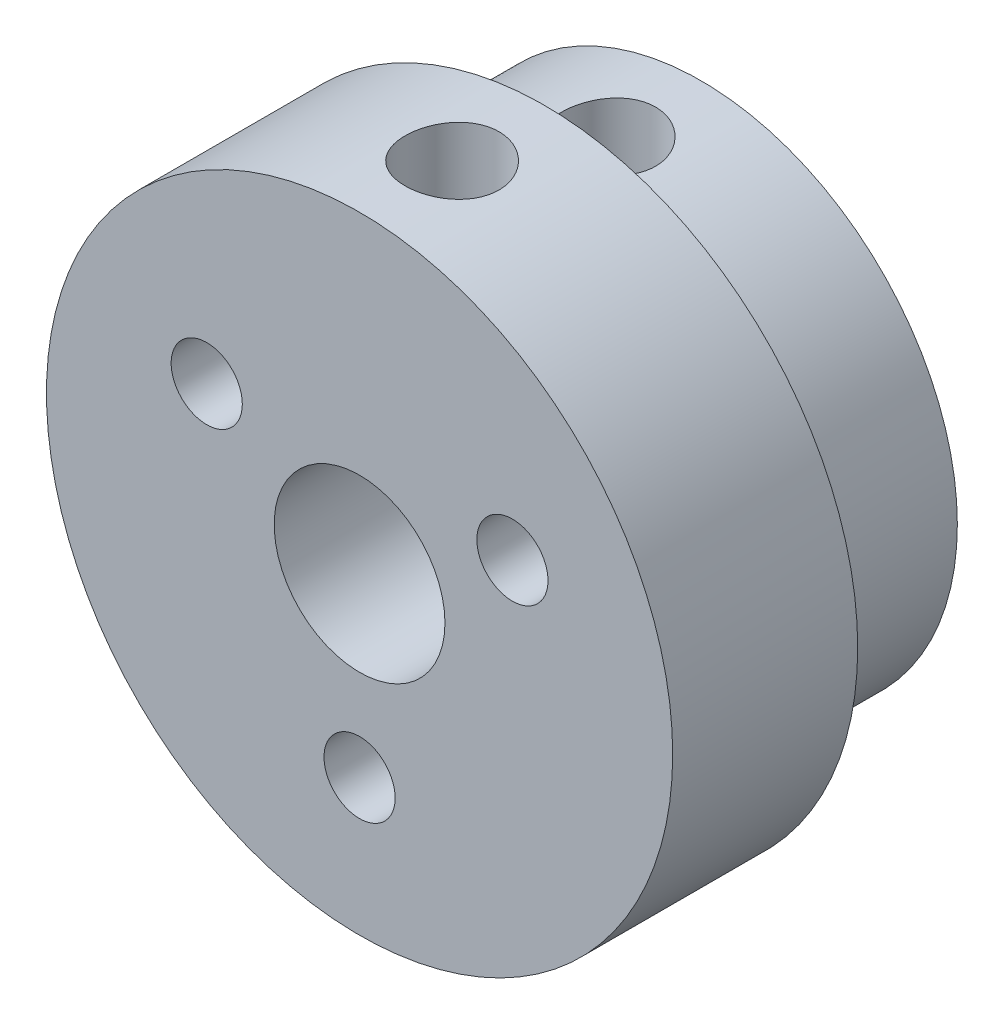
ISO-10303-21;
HEADER;
FILE_DESCRIPTION(('STEP AP214'),'2;1');
FILE_NAME('part.step','',(''),(''),'','','');
FILE_SCHEMA(('AUTOMOTIVE_DESIGN { 1 0 10303 214 1 1 1 1 }'));
ENDSEC;
DATA;
#1=APPLICATION_CONTEXT('core data for automotive mechanical design processes');
#2=APPLICATION_PROTOCOL_DEFINITION('international standard','automotive_design',2000,#1);
#3=PRODUCT_CONTEXT('',#1,'mechanical');
#4=PRODUCT('Part','Part','',(#3));
#5=PRODUCT_RELATED_PRODUCT_CATEGORY('part','',(#4));
#6=PRODUCT_DEFINITION_FORMATION('','',#4);
#7=PRODUCT_DEFINITION_CONTEXT('part definition',#1,'design');
#8=PRODUCT_DEFINITION('design','',#6,#7);
#9=PRODUCT_DEFINITION_SHAPE('','',#8);
#10=(LENGTH_UNIT() NAMED_UNIT(*) SI_UNIT(.MILLI.,.METRE.));
#11=(NAMED_UNIT(*) PLANE_ANGLE_UNIT() SI_UNIT($,.RADIAN.));
#12=(NAMED_UNIT(*) SI_UNIT($,.STERADIAN.) SOLID_ANGLE_UNIT());
#13=UNCERTAINTY_MEASURE_WITH_UNIT(LENGTH_MEASURE(1.E-05),#10,'distance_accuracy_value','');
#14=(GEOMETRIC_REPRESENTATION_CONTEXT(3) GLOBAL_UNCERTAINTY_ASSIGNED_CONTEXT((#13)) GLOBAL_UNIT_ASSIGNED_CONTEXT((#10,
#11,#12)) REPRESENTATION_CONTEXT('',''));
#15=CARTESIAN_POINT('',(0.,0.,0.));
#16=DIRECTION('',(0.,0.,1.));
#17=DIRECTION('',(1.,0.,0.));
#18=AXIS2_PLACEMENT_3D('',#15,#16,#17);
#19=CARTESIAN_POINT('',(0.,0.,0.));
#20=DIRECTION('',(0.,0.,1.));
#21=DIRECTION('',(1.,0.,0.));
#22=AXIS2_PLACEMENT_3D('',#19,#20,#21);
#23=CYLINDRICAL_SURFACE('',#22,3.);
#24=CARTESIAN_POINT('',(0.,3.,-1.6));
#25=CARTESIAN_POINT('',(0.0856699475452994,2.99999513886583,-1.60000538337831));
#26=CARTESIAN_POINT('',(0.171409071205646,2.99629302255545,-1.60671064559098));
#27=CARTESIAN_POINT('',(0.340286051726047,2.9818478399119,-1.63320221523036));
#28=CARTESIAN_POINT('',(0.42342019537986,2.97109516282085,-1.65300637834803));
#29=CARTESIAN_POINT('',(0.584401577928637,2.9436571869529,-1.70465446432168));
#30=CARTESIAN_POINT('',(0.662269062667418,2.92699634956489,-1.73644877862966));
#31=CARTESIAN_POINT('',(0.811408240635762,2.8892116252981,-1.81087866817394));
#32=CARTESIAN_POINT('',(0.882679651896673,2.86808754775153,-1.85351470658008));
#33=CARTESIAN_POINT('',(1.02211619357275,2.82153252993505,-1.95171533312459));
#34=CARTESIAN_POINT('',(1.08973037342791,2.79590528013301,-2.00796752444415));
#35=CARTESIAN_POINT('',(1.21508634233517,2.74375354722835,-2.1302916084601));
#36=CARTESIAN_POINT('',(1.2728189023456,2.71722825277821,-2.19637257436953));
#37=CARTESIAN_POINT('',(1.38251917690996,2.66321895829991,-2.34422598592266));
#38=CARTESIAN_POINT('',(1.43335857713386,2.635897965792,-2.42690296148472));
#39=CARTESIAN_POINT('',(1.52021547735939,2.58678336476683,-2.60122736563263));
#40=CARTESIAN_POINT('',(1.5562446891168,2.56498539395023,-2.69286763485725));
#41=CARTESIAN_POINT('',(1.60989890926138,2.53163475086558,-2.8767694484273));
#42=CARTESIAN_POINT('',(1.62854263347079,2.51952192354843,-2.96862615345283));
#43=CARTESIAN_POINT('',(1.64991120631134,2.5055890563389,-3.15488944855667));
#44=CARTESIAN_POINT('',(1.65265887915297,2.50375425894471,-3.24929218702398));
#45=CARTESIAN_POINT('',(1.64290000078864,2.51015646726158,-3.42242835674957));
#46=CARTESIAN_POINT('',(1.63265157443424,2.51690299364892,-3.50135975849933));
#47=CARTESIAN_POINT('',(1.60118639026894,2.53703527550373,-3.65612941990325));
#48=CARTESIAN_POINT('',(1.5799646365691,2.55042405491467,-3.7319662536941));
#49=CARTESIAN_POINT('',(1.52687641342515,2.58256130946142,-3.8804823200009));
#50=CARTESIAN_POINT('',(1.49479033069661,2.60141910516922,-3.9530582377923));
#51=CARTESIAN_POINT('',(1.42107429999088,2.64240902469132,-4.09217102059683));
#52=CARTESIAN_POINT('',(1.37944023253661,2.66454256035721,-4.15870526158193));
#53=CARTESIAN_POINT('',(1.28018349411555,2.71379040847906,-4.29489478358012));
#54=CARTESIAN_POINT('',(1.22107458392543,2.74113957142577,-4.36338605188438));
#55=CARTESIAN_POINT('',(1.09224532196501,2.79497377887706,-4.49002658065135));
#56=CARTESIAN_POINT('',(1.02251777065964,2.82145822218593,-4.54816876589242));
#57=CARTESIAN_POINT('',(0.868605041800935,2.87272134052732,-4.65621482668338));
#58=CARTESIAN_POINT('',(0.783763861453042,2.89726648156192,-4.70530464062892));
#59=CARTESIAN_POINT('',(0.605352377645231,2.93971528365153,-4.78808075343747));
#60=CARTESIAN_POINT('',(0.511790381195993,2.95762518579738,-4.82178153416669));
#61=CARTESIAN_POINT('',(0.327907037980977,2.98333345624201,-4.86961221043824));
#62=CARTESIAN_POINT('',(0.238095480523288,2.99191822782612,-4.88527255151752));
#63=CARTESIAN_POINT('',(0.0567325334425135,3.00083376662002,-4.90153082870693));
#64=CARTESIAN_POINT('',(-0.0348177069344347,3.00116980828416,-4.90213838996179));
#65=CARTESIAN_POINT('',(-0.207487375150858,2.99394177831786,-4.88896548669445));
#66=CARTESIAN_POINT('',(-0.28875177623744,2.98714659587173,-4.87658539871821));
#67=CARTESIAN_POINT('',(-0.447838849624849,2.96746793830126,-4.84015740266736));
#68=CARTESIAN_POINT('',(-0.525661172937911,2.95458384737082,-4.81610831443354));
#69=CARTESIAN_POINT('',(-0.677753407865903,2.92349378037743,-4.75664238404831));
#70=CARTESIAN_POINT('',(-0.751904240945376,2.90517475144826,-4.72098230445308));
#71=CARTESIAN_POINT('',(-0.893363199749703,2.86484215103297,-4.63962865370027));
#72=CARTESIAN_POINT('',(-0.960668811424107,2.8428272299655,-4.59393141551639));
#73=CARTESIAN_POINT('',(-1.09455456288909,2.79420331593949,-4.48795528586164));
#74=CARTESIAN_POINT('',(-1.16021004375817,2.76735592347542,-4.426616716341));
#75=CARTESIAN_POINT('',(-1.28079913012788,2.71365440736755,-4.2940755703225));
#76=CARTESIAN_POINT('',(-1.33572155748716,2.6868003055646,-4.22286284071763));
#77=CARTESIAN_POINT('',(-1.43747254066661,2.63385875511374,-4.06583580659286));
#78=CARTESIAN_POINT('',(-1.48334076829298,2.60799295737883,-3.97931692312463));
#79=CARTESIAN_POINT('',(-1.55942876653783,2.56323063992907,-3.79800592029134));
#80=CARTESIAN_POINT('',(-1.58967133039468,2.54432398053561,-3.70322608860007));
#81=CARTESIAN_POINT('',(-1.6306246255404,2.51825420457375,-3.51773762241447));
#82=CARTESIAN_POINT('',(-1.64294477567078,2.51013022153209,-3.4275252194605));
#83=CARTESIAN_POINT('',(-1.65249034912289,2.50386093509844,-3.24598953071196));
#84=CARTESIAN_POINT('',(-1.64972872967261,2.50570706604924,-3.15466726572743));
#85=CARTESIAN_POINT('',(-1.63075691736924,2.51807870697286,-2.98678047844449));
#86=CARTESIAN_POINT('',(-1.61642825416934,2.52738874118224,-2.90989902646687));
#87=CARTESIAN_POINT('',(-1.57741079979876,2.55192145753237,-2.75980458104002));
#88=CARTESIAN_POINT('',(-1.55271775279779,2.56714656833463,-2.68659310839999));
#89=CARTESIAN_POINT('',(-1.492056117962,2.60289749299613,-2.54086035370703));
#90=CARTESIAN_POINT('',(-1.45548954002738,2.62369085726804,-2.4686560041008));
#91=CARTESIAN_POINT('',(-1.37268509596928,2.66794671801683,-2.33092397849966));
#92=CARTESIAN_POINT('',(-1.32644209751913,2.69141062791391,-2.26539987321332));
#93=CARTESIAN_POINT('',(-1.21715006880685,2.74276036037727,-2.13215026044466));
#94=CARTESIAN_POINT('',(-1.15260264369496,2.77076245736401,-2.06569176481672));
#95=CARTESIAN_POINT('',(-1.01279351012943,2.82486614857147,-1.94411557257786));
#96=CARTESIAN_POINT('',(-0.937524174112383,2.85096636964491,-1.889006018451));
#97=CARTESIAN_POINT('',(-0.774887264813823,2.89948189270181,-1.79006196603414));
#98=CARTESIAN_POINT('',(-0.687189892415587,2.92173740350452,-1.74668643559364));
#99=CARTESIAN_POINT('',(-0.504223640414892,2.95878417900051,-1.67589028566925));
#100=CARTESIAN_POINT('',(-0.408974898948849,2.97359457153256,-1.64842875222927));
#101=CARTESIAN_POINT('',(-0.260510618519071,2.98911434756595,-1.61985794198771));
#102=CARTESIAN_POINT('',(-0.208783056433921,2.99318008334623,-1.61242756798774));
#103=CARTESIAN_POINT('',(-0.104712273399592,2.99862437594613,-1.60249698717911));
#104=CARTESIAN_POINT('',(-0.0523690613485741,3.00000297155585,-1.59999670920227));
#105=CARTESIAN_POINT('',(0.,3.,-1.6));
#106=B_SPLINE_CURVE_WITH_KNOTS('',3,(#24,#25,#26,#27,#28,#29,#30,#31,#32,#33,#34,#35,#36,#37,
#38,#39,#40,#41,#42,#43,#44,#45,#46,#47,#48,#49,#50,#51,#52,#53,#54,#55,#56,#57,#58,#59,#60,#61,
#62,#63,#64,#65,#66,#67,#68,#69,#70,#71,#72,#73,#74,#75,#76,#77,#78,#79,#80,#81,#82,#83,#84,#85,
#86,#87,#88,#89,#90,#91,#92,#93,#94,#95,#96,#97,#98,#99,#100,#101,#102,#103,#104,#105),
.UNSPECIFIED.,.T.,.F.,(4,2,2,2,2,2,2,2,2,2,2,2,2,2,2,2,2,2,2,2,2,2,2,2,2,2,2,2,2,2,2,2,2,2,2,2,
2,2,2,2,4),(0.,0.256799016537927,0.513948810602823,0.770046131883808,1.02615439574975,
1.29988051794781,1.57386091081864,1.87483382859252,2.17556827984511,2.45730761481344,
2.7386423161532,2.97715628850378,3.21577894619804,3.45954576386221,3.70341795322453,
3.98576982265921,4.26831398861796,4.5698079028087,4.8710175081485,5.14417314031286,
5.41715410504553,5.66345591892143,5.90978264803877,6.16164305576708,6.41359563296034,
6.69375293580821,6.97420047673715,7.27643629132652,7.57822997932257,7.85076329691247,
8.12306250931442,8.35830132419628,8.59363682764365,8.84338665158085,9.09326927891541,
9.38234984684168,9.6716371032665,9.97098879991467,10.2695674268337,10.4265480013941,
10.5835263098519),.UNSPECIFIED.);
#107=CARTESIAN_POINT('',(0.,3.,-1.6));
#108=VERTEX_POINT('',#107);
#109=EDGE_CURVE('E63',#108,#108,#106,.T.);
#110=ORIENTED_EDGE('',*,*,#109,.T.);
#111=EDGE_LOOP('',(#110));
#112=FACE_BOUND('',#111,.T.);
#113=CARTESIAN_POINT('',(0.,3.,-7.1));
#114=CARTESIAN_POINT('',(0.0856699475452995,2.99999513886583,-7.10000538337831));
#115=CARTESIAN_POINT('',(0.171409071205646,2.99629302255545,-7.10671064559098));
#116=CARTESIAN_POINT('',(0.340286051726047,2.9818478399119,-7.13320221523036));
#117=CARTESIAN_POINT('',(0.42342019537986,2.97109516282085,-7.15300637834803));
#118=CARTESIAN_POINT('',(0.584401577928637,2.9436571869529,-7.20465446432168));
#119=CARTESIAN_POINT('',(0.662269062667418,2.92699634956489,-7.23644877862966));
#120=CARTESIAN_POINT('',(0.811408240635762,2.8892116252981,-7.31087866817394));
#121=CARTESIAN_POINT('',(0.882679651896673,2.86808754775153,-7.35351470658007));
#122=CARTESIAN_POINT('',(1.02211619357275,2.82153252993505,-7.45171533312459));
#123=CARTESIAN_POINT('',(1.08973037342791,2.79590528013301,-7.50796752444415));
#124=CARTESIAN_POINT('',(1.21508634233517,2.74375354722835,-7.6302916084601));
#125=CARTESIAN_POINT('',(1.2728189023456,2.71722825277821,-7.69637257436953));
#126=CARTESIAN_POINT('',(1.38251917690996,2.66321895829991,-7.84422598592266));
#127=CARTESIAN_POINT('',(1.43335857713386,2.635897965792,-7.92690296148472));
#128=CARTESIAN_POINT('',(1.52021547735939,2.58678336476683,-8.10122736563263));
#129=CARTESIAN_POINT('',(1.5562446891168,2.56498539395023,-8.19286763485725));
#130=CARTESIAN_POINT('',(1.60989890926138,2.53163475086558,-8.37676944842729));
#131=CARTESIAN_POINT('',(1.62854263347079,2.51952192354843,-8.46862615345283));
#132=CARTESIAN_POINT('',(1.64991120631134,2.5055890563389,-8.65488944855667));
#133=CARTESIAN_POINT('',(1.65265887915297,2.50375425894471,-8.74929218702398));
#134=CARTESIAN_POINT('',(1.64290000078864,2.51015646726158,-8.92242835674957));
#135=CARTESIAN_POINT('',(1.63265157443424,2.51690299364892,-9.00135975849933));
#136=CARTESIAN_POINT('',(1.60118639026894,2.53703527550373,-9.15612941990325));
#137=CARTESIAN_POINT('',(1.5799646365691,2.55042405491467,-9.2319662536941));
#138=CARTESIAN_POINT('',(1.52687641342515,2.58256130946142,-9.3804823200009));
#139=CARTESIAN_POINT('',(1.49479033069661,2.60141910516922,-9.45305823779229));
#140=CARTESIAN_POINT('',(1.42107429999088,2.64240902469132,-9.59217102059683));
#141=CARTESIAN_POINT('',(1.37944023253661,2.66454256035721,-9.65870526158193));
#142=CARTESIAN_POINT('',(1.28018349411555,2.71379040847906,-9.79489478358012));
#143=CARTESIAN_POINT('',(1.22107458392543,2.74113957142577,-9.86338605188438));
#144=CARTESIAN_POINT('',(1.09224532196501,2.79497377887706,-9.99002658065135));
#145=CARTESIAN_POINT('',(1.02251777065964,2.82145822218593,-10.0481687658924));
#146=CARTESIAN_POINT('',(0.868605041800935,2.87272134052732,-10.1562148266834));
#147=CARTESIAN_POINT('',(0.783763861453042,2.89726648156192,-10.2053046406289));
#148=CARTESIAN_POINT('',(0.605352377645232,2.93971528365153,-10.2880807534375));
#149=CARTESIAN_POINT('',(0.511790381195994,2.95762518579738,-10.3217815341667));
#150=CARTESIAN_POINT('',(0.327907037980979,2.98333345624201,-10.3696122104382));
#151=CARTESIAN_POINT('',(0.23809548052329,2.99191822782612,-10.3852725515175));
#152=CARTESIAN_POINT('',(0.0567325334425145,3.00083376662002,-10.4015308287069));
#153=CARTESIAN_POINT('',(-0.0348177069344337,3.00116980828416,-10.4021383899618));
#154=CARTESIAN_POINT('',(-0.207487375150857,2.99394177831786,-10.3889654866945));
#155=CARTESIAN_POINT('',(-0.288751776237439,2.98714659587173,-10.3765853987182));
#156=CARTESIAN_POINT('',(-0.447838849624848,2.96746793830126,-10.3401574026674));
#157=CARTESIAN_POINT('',(-0.52566117293791,2.95458384737082,-10.3161083144335));
#158=CARTESIAN_POINT('',(-0.677753407865903,2.92349378037743,-10.2566423840483));
#159=CARTESIAN_POINT('',(-0.751904240945377,2.90517475144826,-10.2209823044531));
#160=CARTESIAN_POINT('',(-0.893363199749703,2.86484215103297,-10.1396286537003));
#161=CARTESIAN_POINT('',(-0.960668811424107,2.8428272299655,-10.0939314155164));
#162=CARTESIAN_POINT('',(-1.09455456288909,2.79420331593949,-9.98795528586164));
#163=CARTESIAN_POINT('',(-1.16021004375817,2.76735592347542,-9.926616716341));
#164=CARTESIAN_POINT('',(-1.28079913012788,2.71365440736755,-9.79407557032251));
#165=CARTESIAN_POINT('',(-1.33572155748716,2.6868003055646,-9.72286284071763));
#166=CARTESIAN_POINT('',(-1.43747254066661,2.63385875511374,-9.56583580659286));
#167=CARTESIAN_POINT('',(-1.48334076829298,2.60799295737883,-9.47931692312463));
#168=CARTESIAN_POINT('',(-1.55942876653783,2.56323063992907,-9.29800592029134));
#169=CARTESIAN_POINT('',(-1.58967133039468,2.54432398053561,-9.20322608860007));
#170=CARTESIAN_POINT('',(-1.6306246255404,2.51825420457375,-9.01773762241447));
#171=CARTESIAN_POINT('',(-1.64294477567078,2.51013022153209,-8.9275252194605));
#172=CARTESIAN_POINT('',(-1.65249034912289,2.50386093509844,-8.74598953071196));
#173=CARTESIAN_POINT('',(-1.64972872967261,2.50570706604924,-8.65466726572743));
#174=CARTESIAN_POINT('',(-1.63075691736924,2.51807870697286,-8.48678047844449));
#175=CARTESIAN_POINT('',(-1.61642825416934,2.52738874118224,-8.40989902646687));
#176=CARTESIAN_POINT('',(-1.57741079979876,2.55192145753237,-8.25980458104002));
#177=CARTESIAN_POINT('',(-1.55271775279779,2.56714656833463,-8.18659310839999));
#178=CARTESIAN_POINT('',(-1.492056117962,2.60289749299613,-8.04086035370703));
#179=CARTESIAN_POINT('',(-1.45548954002738,2.62369085726804,-7.9686560041008));
#180=CARTESIAN_POINT('',(-1.37268509596929,2.66794671801683,-7.83092397849966));
#181=CARTESIAN_POINT('',(-1.32644209751913,2.69141062791391,-7.76539987321332));
#182=CARTESIAN_POINT('',(-1.21715006880685,2.74276036037727,-7.63215026044466));
#183=CARTESIAN_POINT('',(-1.15260264369496,2.77076245736401,-7.56569176481672));
#184=CARTESIAN_POINT('',(-1.01279351012943,2.82486614857147,-7.44411557257786));
#185=CARTESIAN_POINT('',(-0.937524174112383,2.85096636964491,-7.389006018451));
#186=CARTESIAN_POINT('',(-0.774887264813824,2.89948189270181,-7.29006196603414));
#187=CARTESIAN_POINT('',(-0.687189892415588,2.92173740350452,-7.24668643559364));
#188=CARTESIAN_POINT('',(-0.504223640414893,2.95878417900051,-7.17589028566925));
#189=CARTESIAN_POINT('',(-0.40897489894885,2.97359457153256,-7.14842875222927));
#190=CARTESIAN_POINT('',(-0.260510618519071,2.98911434756595,-7.11985794198771));
#191=CARTESIAN_POINT('',(-0.20878305643392,2.99318008334623,-7.11242756798774));
#192=CARTESIAN_POINT('',(-0.104712273399591,2.99862437594613,-7.10249698717911));
#193=CARTESIAN_POINT('',(-0.0523690613485736,3.00000297155585,-7.09999670920227));
#194=CARTESIAN_POINT('',(0.,3.,-7.1));
#195=B_SPLINE_CURVE_WITH_KNOTS('',3,(#113,#114,#115,#116,#117,#118,#119,#120,#121,#122,#123,
#124,#125,#126,#127,#128,#129,#130,#131,#132,#133,#134,#135,#136,#137,#138,#139,#140,#141,#142,
#143,#144,#145,#146,#147,#148,#149,#150,#151,#152,#153,#154,#155,#156,#157,#158,#159,#160,#161,
#162,#163,#164,#165,#166,#167,#168,#169,#170,#171,#172,#173,#174,#175,#176,#177,#178,#179,#180,
#181,#182,#183,#184,#185,#186,#187,#188,#189,#190,#191,#192,#193,#194),.UNSPECIFIED.,.T.,.F.,(4,
2,2,2,2,2,2,2,2,2,2,2,2,2,2,2,2,2,2,2,2,2,2,2,2,2,2,2,2,2,2,2,2,2,2,2,2,2,2,2,4),(0.,
0.256799016537927,0.513948810602823,0.770046131883809,1.02615439574975,1.29988051794781,
1.57386091081864,1.87483382859252,2.17556827984511,2.45730761481344,2.7386423161532,
2.97715628850378,3.21577894619804,3.4595457638622,3.70341795322454,3.98576982265921,
4.26831398861796,4.5698079028087,4.8710175081485,5.14417314031286,5.41715410504553,
5.66345591892143,5.90978264803877,6.16164305576709,6.41359563296034,6.69375293580821,
6.97420047673715,7.27643629132653,7.57822997932257,7.85076329691247,8.12306250931442,
8.35830132419628,8.59363682764365,8.84338665158085,9.09326927891541,9.38234984684168,
9.6716371032665,9.97098879991468,10.2695674268337,10.4265480013941,10.5835263098519),.UNSPECIFIED.);
#196=CARTESIAN_POINT('',(0.,3.,-7.1));
#197=VERTEX_POINT('',#196);
#198=EDGE_CURVE('E57',#197,#197,#195,.T.);
#199=ORIENTED_EDGE('',*,*,#198,.T.);
#200=EDGE_LOOP('',(#199));
#201=FACE_BOUND('',#200,.T.);
#202=CARTESIAN_POINT('',(0.,0.,-12.));
#203=DIRECTION('',(0.,0.,1.));
#204=DIRECTION('',(1.,0.,0.));
#205=AXIS2_PLACEMENT_3D('',#202,#203,#204);
#206=CIRCLE('',#205,3.);
#207=CARTESIAN_POINT('',(3.,0.,-12.));
#208=VERTEX_POINT('',#207);
#209=EDGE_CURVE('E130',#208,#208,#206,.T.);
#210=ORIENTED_EDGE('',*,*,#209,.F.);
#211=EDGE_LOOP('',(#210));
#212=FACE_BOUND('',#211,.T.);
#213=CARTESIAN_POINT('',(0.,0.,0.));
#214=DIRECTION('',(0.,0.,1.));
#215=DIRECTION('',(1.,0.,0.));
#216=AXIS2_PLACEMENT_3D('',#213,#214,#215);
#217=CIRCLE('',#216,3.);
#218=CARTESIAN_POINT('',(3.,0.,0.));
#219=VERTEX_POINT('',#218);
#220=EDGE_CURVE('E45',#219,#219,#217,.T.);
#221=ORIENTED_EDGE('',*,*,#220,.T.);
#222=EDGE_LOOP('',(#221));
#223=FACE_BOUND('',#222,.T.);
#224=ADVANCED_FACE('F34',(#112,#201,#212,#223),#23,.F.);
#225=CARTESIAN_POINT('',(0.,3.,0.));
#226=DIRECTION('',(0.,0.,-1.));
#227=DIRECTION('',(-1.,0.,0.));
#228=AXIS2_PLACEMENT_3D('',#225,#226,#227);
#229=PLANE('',#228);
#230=CARTESIAN_POINT('',(5.36935750346352,3.1,0.));
#231=DIRECTION('',(0.,0.,1.));
#232=DIRECTION('',(1.,0.,0.));
#233=AXIS2_PLACEMENT_3D('',#230,#231,#232);
#234=CIRCLE('',#233,1.25);
#235=CARTESIAN_POINT('',(6.61935750346352,3.1,0.));
#236=VERTEX_POINT('',#235);
#237=EDGE_CURVE('E81',#236,#236,#234,.T.);
#238=ORIENTED_EDGE('',*,*,#237,.F.);
#239=EDGE_LOOP('',(#238));
#240=FACE_BOUND('',#239,.T.);
#241=CARTESIAN_POINT('',(-5.36935750346352,3.1,0.));
#242=DIRECTION('',(0.,0.,1.));
#243=DIRECTION('',(1.,0.,0.));
#244=AXIS2_PLACEMENT_3D('',#241,#242,#243);
#245=CIRCLE('',#244,1.25);
#246=CARTESIAN_POINT('',(-4.11935750346353,3.1,0.));
#247=VERTEX_POINT('',#246);
#248=EDGE_CURVE('E112',#247,#247,#245,.T.);
#249=ORIENTED_EDGE('',*,*,#248,.F.);
#250=EDGE_LOOP('',(#249));
#251=FACE_BOUND('',#250,.T.);
#252=CARTESIAN_POINT('',(0.,-6.2,0.));
#253=DIRECTION('',(0.,0.,1.));
#254=DIRECTION('',(1.,0.,0.));
#255=AXIS2_PLACEMENT_3D('',#252,#253,#254);
#256=CIRCLE('',#255,1.25);
#257=CARTESIAN_POINT('',(1.25,-6.2,0.));
#258=VERTEX_POINT('',#257);
#259=EDGE_CURVE('E116',#258,#258,#256,.T.);
#260=ORIENTED_EDGE('',*,*,#259,.F.);
#261=EDGE_LOOP('',(#260));
#262=FACE_BOUND('',#261,.T.);
#263=ORIENTED_EDGE('',*,*,#220,.F.);
#264=EDGE_LOOP('',(#263));
#265=FACE_BOUND('',#264,.T.);
#266=CARTESIAN_POINT('',(0.,0.,0.));
#267=DIRECTION('',(0.,0.,1.));
#268=DIRECTION('',(1.,0.,0.));
#269=AXIS2_PLACEMENT_3D('',#266,#267,#268);
#270=CIRCLE('',#269,11.);
#271=CARTESIAN_POINT('',(11.,0.,0.));
#272=VERTEX_POINT('',#271);
#273=EDGE_CURVE('E49',#272,#272,#270,.T.);
#274=ORIENTED_EDGE('',*,*,#273,.T.);
#275=EDGE_LOOP('',(#274));
#276=FACE_BOUND('',#275,.T.);
#277=ADVANCED_FACE('F99',(#240,#251,#262,#265,#276),#229,.F.);
#278=CARTESIAN_POINT('',(0.,0.,0.));
#279=DIRECTION('',(0.,0.,1.));
#280=DIRECTION('',(1.,0.,0.));
#281=AXIS2_PLACEMENT_3D('',#278,#279,#280);
#282=CYLINDRICAL_SURFACE('',#281,11.);
#283=CARTESIAN_POINT('',(0.,11.,-1.6));
#284=CARTESIAN_POINT('',(-0.0921266989298061,10.9999985234843,-1.60000379919677));
#285=CARTESIAN_POINT('',(-0.184306853590345,10.9988305079074,-1.6077418009247));
#286=CARTESIAN_POINT('',(-0.366090590794404,10.9942834757051,-1.63848151998103));
#287=CARTESIAN_POINT('',(-0.455691575871651,10.9909023063232,-1.66149809923938));
#288=CARTESIAN_POINT('',(-0.629659894844045,10.9823089334148,-1.72209175546439));
#289=CARTESIAN_POINT('',(-0.714031128609477,10.9770981140801,-1.75965782745655));
#290=CARTESIAN_POINT('',(-0.875259471498778,10.965421235029,-1.84825721735855));
#291=CARTESIAN_POINT('',(-0.952117622197706,10.9589553496805,-1.8992886648591));
#292=CARTESIAN_POINT('',(-1.09675139151834,10.945430880906,-2.01379499143386));
#293=CARTESIAN_POINT('',(-1.16445981544805,10.9383684727936,-2.07735430182903));
#294=CARTESIAN_POINT('',(-1.28829239735843,10.9244768724656,-2.21493045778326));
#295=CARTESIAN_POINT('',(-1.34441588900229,10.9176476936836,-2.28894790445637));
#296=CARTESIAN_POINT('',(-1.44374702449937,10.904958652046,-2.44579070787474));
#297=CARTESIAN_POINT('',(-1.48688965740925,10.8991037317253,-2.52865767167947));
#298=CARTESIAN_POINT('',(-1.55861895388161,10.8890783243689,-2.70056410270997));
#299=CARTESIAN_POINT('',(-1.58720641078079,10.8849077455299,-2.78960323321828));
#300=CARTESIAN_POINT('',(-1.62880518678802,10.8787608184054,-2.97061984605889));
#301=CARTESIAN_POINT('',(-1.64193154004569,10.8767682731538,-3.06257033274882));
#302=CARTESIAN_POINT('',(-1.65259186437325,10.8751538386764,-3.247388782586));
#303=CARTESIAN_POINT('',(-1.65012673071176,10.8755318133346,-3.34025669274874));
#304=CARTESIAN_POINT('',(-1.62976806575866,10.8786009018765,-3.52346118821355));
#305=CARTESIAN_POINT('',(-1.61200265520525,10.881272806377,-3.61381237913328));
#306=CARTESIAN_POINT('',(-1.56174829144107,10.88859868939,-3.79023680575868));
#307=CARTESIAN_POINT('',(-1.52925892171593,10.8932527239732,-3.87630992036882));
#308=CARTESIAN_POINT('',(-1.4503456388271,10.9040396910003,-4.04212470841114));
#309=CARTESIAN_POINT('',(-1.40386745711517,10.9101783644318,-4.12184016600163));
#310=CARTESIAN_POINT('',(-1.2983345444185,10.92323878332,-4.27238905536012));
#311=CARTESIAN_POINT('',(-1.23927898800726,10.9301605801575,-4.3432219036963));
#312=CARTESIAN_POINT('',(-1.10956442386072,10.9440922036183,-4.47473742681369));
#313=CARTESIAN_POINT('',(-1.0387952626062,10.951102218241,-4.53531148931497));
#314=CARTESIAN_POINT('',(-0.888037798883604,10.9643561241331,-4.64373952795798));
#315=CARTESIAN_POINT('',(-0.808049456046986,10.9706000120476,-4.69159344839828));
#316=CARTESIAN_POINT('',(-0.641030058035054,10.9816246714393,-4.7732283951495));
#317=CARTESIAN_POINT('',(-0.553994845620458,10.9864045711797,-4.80700104102432));
#318=CARTESIAN_POINT('',(-0.375400500735766,10.9939553961278,-4.85942032865391));
#319=CARTESIAN_POINT('',(-0.28384167454786,10.9967264571501,-4.87806799299713));
#320=CARTESIAN_POINT('',(-0.0997365244080109,10.9999293924726,-4.89956355279836));
#321=CARTESIAN_POINT('',(-0.00720800505751736,11.0003833729943,-4.90256076851725));
#322=CARTESIAN_POINT('',(0.177030345428511,10.9989611711675,-4.89306669415787));
#323=CARTESIAN_POINT('',(0.268740201820064,10.9970850609551,-4.88057588356509));
#324=CARTESIAN_POINT('',(0.448285626174548,10.9912271547687,-4.8405844898047));
#325=CARTESIAN_POINT('',(0.53613775938782,10.9872555672878,-4.81315665436607));
#326=CARTESIAN_POINT('',(0.705996454507297,10.9776505922421,-4.74414650279207));
#327=CARTESIAN_POINT('',(0.788002741674608,10.9720171266372,-4.70256352193301));
#328=CARTESIAN_POINT('',(0.944498477221111,10.9596595071555,-4.60607315297975));
#329=CARTESIAN_POINT('',(1.01892891088072,10.9529277178942,-4.55107104598595));
#330=CARTESIAN_POINT('',(1.15755604049547,10.9391464931338,-4.42943560720838));
#331=CARTESIAN_POINT('',(1.22175214127274,10.9320970391915,-4.36280159944289));
#332=CARTESIAN_POINT('',(1.33863163452915,10.9184049073494,-4.21912911350586));
#333=CARTESIAN_POINT('',(1.39121493222163,10.9117660961935,-4.14200878228575));
#334=CARTESIAN_POINT('',(1.48268042197642,10.8997154101539,-3.97994235543705));
#335=CARTESIAN_POINT('',(1.52156298422079,10.8943035021219,-3.89499647132639));
#336=CARTESIAN_POINT('',(1.58436814056338,10.8853473630951,-3.71998871301456));
#337=CARTESIAN_POINT('',(1.60834340855799,10.8817965630708,-3.62994609293163));
#338=CARTESIAN_POINT('',(1.64082104451745,10.8769472052758,-3.44705508302138));
#339=CARTESIAN_POINT('',(1.64932448101373,10.8756484919695,-3.35420688740586));
#340=CARTESIAN_POINT('',(1.65059165336384,10.8754561587193,-3.16933803035264));
#341=CARTESIAN_POINT('',(1.64351277384044,10.8765384896685,-3.07731843406739));
#342=CARTESIAN_POINT('',(1.61415352498816,10.8809340267229,-2.89579421034413));
#343=CARTESIAN_POINT('',(1.59187318002489,10.8842472292523,-2.80628957887527));
#344=CARTESIAN_POINT('',(1.53279910870531,10.8927227872353,-2.63237960954224));
#345=CARTESIAN_POINT('',(1.49601638256745,10.8978837408768,-2.54797046252322));
#346=CARTESIAN_POINT('',(1.4089973440654,10.9094750001347,-2.38649600281736));
#347=CARTESIAN_POINT('',(1.35876057615652,10.91590534873,-2.30943093891599));
#348=CARTESIAN_POINT('',(1.2456877142508,10.9293881770143,-2.16403263622731));
#349=CARTESIAN_POINT('',(1.18273505943786,10.9364460467016,-2.09579053342823));
#350=CARTESIAN_POINT('',(1.04626372519112,10.950343677093,-1.9707829897334));
#351=CARTESIAN_POINT('',(0.972742593186035,10.9571833867183,-1.91402022016623));
#352=CARTESIAN_POINT('',(0.816745278298094,10.9699170436957,-1.8133035557319));
#353=CARTESIAN_POINT('',(0.734222034441237,10.975805578417,-1.76942187986378));
#354=CARTESIAN_POINT('',(0.562927057273592,10.9859203168326,-1.69620763156615));
#355=CARTESIAN_POINT('',(0.474161904806375,10.9901482412233,-1.66685999094095));
#356=CARTESIAN_POINT('',(0.320832300678263,10.9955003318766,-1.63020452301888));
#357=CARTESIAN_POINT('',(0.257214246844807,10.9971790409751,-1.61889513830731));
#358=CARTESIAN_POINT('',(0.129072868760139,10.9994293854269,-1.60379159251609));
#359=CARTESIAN_POINT('',(0.0645495557678593,11.0000010345365,-1.5999973380522));
#360=CARTESIAN_POINT('',(0.,11.,-1.6));
#361=B_SPLINE_CURVE_WITH_KNOTS('',3,(#283,#284,#285,#286,#287,#288,#289,#290,#291,#292,#293,
#294,#295,#296,#297,#298,#299,#300,#301,#302,#303,#304,#305,#306,#307,#308,#309,#310,#311,#312,
#313,#314,#315,#316,#317,#318,#319,#320,#321,#322,#323,#324,#325,#326,#327,#328,#329,#330,#331,
#332,#333,#334,#335,#336,#337,#338,#339,#340,#341,#342,#343,#344,#345,#346,#347,#348,#349,#350,
#351,#352,#353,#354,#355,#356,#357,#358,#359,#360),.UNSPECIFIED.,.T.,.F.,(4,2,2,2,2,2,2,2,2,2,2,
2,2,2,2,2,2,2,2,2,2,2,2,2,2,2,2,2,2,2,2,2,2,2,2,2,2,2,4),(0.,0.276144225534829,
0.552557459222065,0.82876202594156,1.10492824661736,1.38302357750527,1.66113489929838,
1.94061672634912,2.22008331848056,2.49745721066516,2.7748151760888,3.0498729491532,
3.32493850359397,3.60108521823774,3.87725006139387,4.15617720380949,4.43510556762534,
4.71419969883361,4.99327495912741,5.2696826439868,5.5460817719027,5.82114663862542,
6.096224424139,6.37330306840597,6.65039782031491,6.92979503243138,7.20918469489714,
7.48758145802884,7.76595899350893,8.04153777087169,8.31711610652519,8.5924858138256,
8.86786484613566,9.14589312962291,9.42398603815605,9.70360955723205,9.98294256587584,
10.1764283717669,10.3699117733562),.UNSPECIFIED.);
#362=CARTESIAN_POINT('',(0.,11.,-1.6));
#363=VERTEX_POINT('',#362);
#364=EDGE_CURVE('E10',#363,#363,#361,.T.);
#365=ORIENTED_EDGE('',*,*,#364,.T.);
#366=EDGE_LOOP('',(#365));
#367=FACE_BOUND('',#366,.T.);
#368=ORIENTED_EDGE('',*,*,#273,.F.);
#369=EDGE_LOOP('',(#368));
#370=FACE_BOUND('',#369,.T.);
#371=CARTESIAN_POINT('',(0.,0.,-6.5));
#372=DIRECTION('',(0.,0.,1.));
#373=DIRECTION('',(1.,0.,0.));
#374=AXIS2_PLACEMENT_3D('',#371,#372,#373);
#375=CIRCLE('',#374,11.);
#376=CARTESIAN_POINT('',(11.,0.,-6.5));
#377=VERTEX_POINT('',#376);
#378=EDGE_CURVE('E54',#377,#377,#375,.T.);
#379=ORIENTED_EDGE('',*,*,#378,.T.);
#380=EDGE_LOOP('',(#379));
#381=FACE_BOUND('',#380,.T.);
#382=ADVANCED_FACE('F95',(#367,#370,#381),#282,.T.);
#383=CARTESIAN_POINT('',(0.,11.,-6.5));
#384=DIRECTION('',(0.,0.,1.));
#385=DIRECTION('',(1.,0.,0.));
#386=AXIS2_PLACEMENT_3D('',#383,#384,#385);
#387=PLANE('',#386);
#388=ORIENTED_EDGE('',*,*,#378,.F.);
#389=EDGE_LOOP('',(#388));
#390=FACE_BOUND('',#389,.T.);
#391=CARTESIAN_POINT('',(0.,0.,-6.5));
#392=DIRECTION('',(0.,0.,1.));
#393=DIRECTION('',(1.,0.,0.));
#394=AXIS2_PLACEMENT_3D('',#391,#392,#393);
#395=CIRCLE('',#394,9.);
#396=CARTESIAN_POINT('',(9.,0.,-6.5));
#397=VERTEX_POINT('',#396);
#398=EDGE_CURVE('E123',#397,#397,#395,.T.);
#399=ORIENTED_EDGE('',*,*,#398,.T.);
#400=EDGE_LOOP('',(#399));
#401=FACE_BOUND('',#400,.T.);
#402=ADVANCED_FACE('F91',(#390,#401),#387,.F.);
#403=CARTESIAN_POINT('',(0.,0.,0.));
#404=DIRECTION('',(0.,0.,1.));
#405=DIRECTION('',(1.,0.,0.));
#406=AXIS2_PLACEMENT_3D('',#403,#404,#405);
#407=CYLINDRICAL_SURFACE('',#406,9.);
#408=CARTESIAN_POINT('',(0.,9.,-7.1));
#409=CARTESIAN_POINT('',(-0.0918563401856293,8.99999835060966,-7.10000354880864));
#410=CARTESIAN_POINT('',(-0.183759286218882,8.99857918884984,-7.10769645308592));
#411=CARTESIAN_POINT('',(-0.364977948965815,8.99305463028745,-7.13824646901407));
#412=CARTESIAN_POINT('',(-0.454291372258897,8.98894692395007,-7.16111661857754));
#413=CARTESIAN_POINT('',(-0.62768374360439,8.97850503368057,-7.22129940363372));
#414=CARTESIAN_POINT('',(-0.711767250233597,8.97217282164655,-7.25859925097237));
#415=CARTESIAN_POINT('',(-0.872474263435697,8.95797438424647,-7.34654689675268));
#416=CARTESIAN_POINT('',(-0.949098424671131,8.95010829368215,-7.39719352237784));
#417=CARTESIAN_POINT('',(-1.09359910356556,8.93361021014429,-7.51101410921454));
#418=CARTESIAN_POINT('',(-1.16137765650479,8.92497117839848,-7.5743114340031));
#419=CARTESIAN_POINT('',(-1.28541590153586,8.90795346370862,-7.71137122549752));
#420=CARTESIAN_POINT('',(-1.34167478807873,8.89957479900629,-7.78513442345236));
#421=CARTESIAN_POINT('',(-1.44148110351233,8.88395813367481,-7.94172041908156));
#422=CARTESIAN_POINT('',(-1.48492945431508,8.8767292132907,-8.02460735326401));
#423=CARTESIAN_POINT('',(-1.55724724466983,8.86432940629066,-8.1966585334586));
#424=CARTESIAN_POINT('',(-1.58611788379855,8.85915835034377,-8.28582226227507));
#425=CARTESIAN_POINT('',(-1.62814749837401,8.85153045632432,-8.46684974635425));
#426=CARTESIAN_POINT('',(-1.64147697365671,8.84904418663057,-8.55867265174953));
#427=CARTESIAN_POINT('',(-1.65257498692857,8.84697857859139,-8.74328270376018));
#428=CARTESIAN_POINT('',(-1.65034485838024,8.84739899114241,-8.83606976706644));
#429=CARTESIAN_POINT('',(-1.63052535234046,8.85107243387296,-9.01874282136491));
#430=CARTESIAN_POINT('',(-1.61312935830109,8.85428979801769,-9.10865061674629));
#431=CARTESIAN_POINT('',(-1.56377625687946,8.86313864762649,-9.2842495525457));
#432=CARTESIAN_POINT('',(-1.53181855546816,8.86877023157548,-9.36994052078481));
#433=CARTESIAN_POINT('',(-1.45405863746821,8.88185052793626,-9.53524191251836));
#434=CARTESIAN_POINT('',(-1.40817787366259,8.88930950236372,-9.61481454084686));
#435=CARTESIAN_POINT('',(-1.30392981237183,8.90519728772881,-9.76520458131248));
#436=CARTESIAN_POINT('',(-1.2455613015963,8.91362619286663,-9.83602114166775));
#437=CARTESIAN_POINT('',(-1.11694967129332,8.93065979872225,-9.96800658577757));
#438=CARTESIAN_POINT('',(-1.04654103501511,8.93926523580672,-10.029014203344));
#439=CARTESIAN_POINT('',(-0.896402881240979,8.95556555246463,-10.1383757078399));
#440=CARTESIAN_POINT('',(-0.81667327792689,8.96326042365318,-10.1867294782521));
#441=CARTESIAN_POINT('',(-0.649991673656468,8.97688712058931,-10.2694325485301));
#442=CARTESIAN_POINT('',(-0.563031435204719,8.98281689925138,-10.3037656047412));
#443=CARTESIAN_POINT('',(-0.384445293378827,8.9922293552611,-10.3572924221242));
#444=CARTESIAN_POINT('',(-0.292819864524541,8.99571228095924,-10.3764877197714));
#445=CARTESIAN_POINT('',(-0.108892206896278,8.9998046368878,-10.3989708946811));
#446=CARTESIAN_POINT('',(-0.0166178578028455,9.00045399362833,-10.4024798187852));
#447=CARTESIAN_POINT('',(0.167199268852813,8.99891614087115,-10.3940828211038));
#448=CARTESIAN_POINT('',(0.258742080513783,8.99672906437169,-10.3821776220751));
#449=CARTESIAN_POINT('',(0.437800271906288,8.9897889173344,-10.3434741256155));
#450=CARTESIAN_POINT('',(0.525340527688906,8.98505503856335,-10.3167871741518));
#451=CARTESIAN_POINT('',(0.694704345256289,8.97354987691929,-10.2493978346486));
#452=CARTESIAN_POINT('',(0.776527531931819,8.96677846051344,-10.2086945280026));
#453=CARTESIAN_POINT('',(0.933081448267933,8.95184977853793,-10.1139351061694));
#454=CARTESIAN_POINT('',(1.00772869905809,8.94367870992649,-10.0597432923802));
#455=CARTESIAN_POINT('',(1.14694904497453,8.92689385571355,-9.93972941593726));
#456=CARTESIAN_POINT('',(1.21152124257849,8.91828003076047,-9.87390631823918));
#457=CARTESIAN_POINT('',(1.32959418699789,8.90144873167933,-9.73149950899598));
#458=CARTESIAN_POINT('',(1.38294438582436,8.89323765758647,-9.65479009352991));
#459=CARTESIAN_POINT('',(1.4760019251271,8.87826835621664,-9.49336826997022));
#460=CARTESIAN_POINT('',(1.51570975850266,8.87151007645345,-9.40865615115567));
#461=CARTESIAN_POINT('',(1.58013949319582,8.86026133433789,-9.23402386298447));
#462=CARTESIAN_POINT('',(1.60493163214765,8.85576025982359,-9.14413032275689));
#463=CARTESIAN_POINT('',(1.63904383383449,8.84951079711017,-8.96136383620928));
#464=CARTESIAN_POINT('',(1.64836555694266,8.84776211350982,-8.86849121071237));
#465=CARTESIAN_POINT('',(1.65121867237615,8.8472299450701,-8.68390983119083));
#466=CARTESIAN_POINT('',(1.6449874227709,8.84840188735807,-8.5922047900668));
#467=CARTESIAN_POINT('',(1.61742979277769,8.85348032699231,-8.41117270571342));
#468=CARTESIAN_POINT('',(1.59610349330992,8.85738680967949,-8.32184564973906));
#469=CARTESIAN_POINT('',(1.53905940273944,8.867475774888,-8.14822540354369));
#470=CARTESIAN_POINT('',(1.50336621996413,8.87365436407451,-8.06392388736786));
#471=CARTESIAN_POINT('',(1.41862715875643,8.88759431680627,-7.90246772229217));
#472=CARTESIAN_POINT('',(1.36958039460183,8.89535578533286,-7.82531354791944));
#473=CARTESIAN_POINT('',(1.25869662766806,8.91172595985397,-7.67915103664209));
#474=CARTESIAN_POINT('',(1.19668647580681,8.92034520947617,-7.61027521549506));
#475=CARTESIAN_POINT('',(1.06199820645019,8.93737982765602,-7.48382713366159));
#476=CARTESIAN_POINT('',(0.98931764043567,8.94579514890086,-7.42625747448513));
#477=CARTESIAN_POINT('',(0.834608091559632,8.96155795714122,-7.32359787902638));
#478=CARTESIAN_POINT('',(0.752504485294226,8.96889569784106,-7.27861886543705));
#479=CARTESIAN_POINT('',(0.581799309328928,8.9815815504526,-7.203164209246));
#480=CARTESIAN_POINT('',(0.493204013757849,8.98693155389525,-7.17267477061074));
#481=CARTESIAN_POINT('',(0.336941607039533,8.99393221000113,-7.13334546045096));
#482=CARTESIAN_POINT('',(0.270195109334189,8.99619492659055,-7.12086199733921));
#483=CARTESIAN_POINT('',(0.135640863042977,8.99922941304804,-7.10418805441164));
#484=CARTESIAN_POINT('',(0.0678331394854617,9.00000121802507,-7.09999737931175));
#485=CARTESIAN_POINT('',(0.,9.,-7.1));
#486=B_SPLINE_CURVE_WITH_KNOTS('',3,(#408,#409,#410,#411,#412,#413,#414,#415,#416,#417,#418,
#419,#420,#421,#422,#423,#424,#425,#426,#427,#428,#429,#430,#431,#432,#433,#434,#435,#436,#437,
#438,#439,#440,#441,#442,#443,#444,#445,#446,#447,#448,#449,#450,#451,#452,#453,#454,#455,#456,
#457,#458,#459,#460,#461,#462,#463,#464,#465,#466,#467,#468,#469,#470,#471,#472,#473,#474,#475,
#476,#477,#478,#479,#480,#481,#482,#483,#484,#485),.UNSPECIFIED.,.T.,.F.,(4,2,2,2,2,2,2,2,2,2,2,
2,2,2,2,2,2,2,2,2,2,2,2,2,2,2,2,2,2,2,2,2,2,2,2,2,2,2,4),(0.,0.275320976133017,
0.550878771625988,0.826192914580022,1.1014828730185,1.37960125011388,1.6577390688762,
1.9379747706396,2.2181874084928,2.49529605356488,2.77238095063822,3.04598351388717,
3.319597239455,3.5947842004209,3.86999791028249,4.14935425298785,4.42871316793041,
4.70839482130421,4.98804808346799,5.26374788907698,5.53943476779433,5.81307268892926,
6.08672854721143,6.36325739026111,6.63981085345675,6.91986622510816,7.19991147728188,
7.47862746599064,7.75731353937689,8.03177259289669,8.30623017513218,8.58021963948811,
8.85422728156679,9.13215992874285,9.41015645255452,9.69053010630633,9.97063626893503,
10.1739573020538,10.377273547177),.UNSPECIFIED.);
#487=CARTESIAN_POINT('',(0.,9.,-7.1));
#488=VERTEX_POINT('',#487);
#489=EDGE_CURVE('E62',#488,#488,#486,.T.);
#490=ORIENTED_EDGE('',*,*,#489,.T.);
#491=EDGE_LOOP('',(#490));
#492=FACE_BOUND('',#491,.T.);
#493=ORIENTED_EDGE('',*,*,#398,.F.);
#494=EDGE_LOOP('',(#493));
#495=FACE_BOUND('',#494,.T.);
#496=CARTESIAN_POINT('',(0.,0.,-12.));
#497=DIRECTION('',(0.,0.,1.));
#498=DIRECTION('',(1.,0.,0.));
#499=AXIS2_PLACEMENT_3D('',#496,#497,#498);
#500=CIRCLE('',#499,9.);
#501=CARTESIAN_POINT('',(9.,0.,-12.));
#502=VERTEX_POINT('',#501);
#503=EDGE_CURVE('E125',#502,#502,#500,.T.);
#504=ORIENTED_EDGE('',*,*,#503,.T.);
#505=EDGE_LOOP('',(#504));
#506=FACE_BOUND('',#505,.T.);
#507=ADVANCED_FACE('F85',(#492,#495,#506),#407,.T.);
#508=CARTESIAN_POINT('',(0.,9.,-12.));
#509=DIRECTION('',(0.,0.,1.));
#510=DIRECTION('',(1.,0.,0.));
#511=AXIS2_PLACEMENT_3D('',#508,#509,#510);
#512=PLANE('',#511);
#513=CARTESIAN_POINT('',(5.36935750346352,3.1,-12.));
#514=DIRECTION('',(0.,0.,1.));
#515=DIRECTION('',(1.,0.,0.));
#516=AXIS2_PLACEMENT_3D('',#513,#514,#515);
#517=CIRCLE('',#516,1.25);
#518=CARTESIAN_POINT('',(6.61935750346352,3.1,-12.));
#519=VERTEX_POINT('',#518);
#520=EDGE_CURVE('E140',#519,#519,#517,.T.);
#521=ORIENTED_EDGE('',*,*,#520,.T.);
#522=EDGE_LOOP('',(#521));
#523=FACE_BOUND('',#522,.T.);
#524=CARTESIAN_POINT('',(-5.36935750346352,3.1,-12.));
#525=DIRECTION('',(0.,0.,1.));
#526=DIRECTION('',(1.,0.,0.));
#527=AXIS2_PLACEMENT_3D('',#524,#525,#526);
#528=CIRCLE('',#527,1.25);
#529=CARTESIAN_POINT('',(-4.11935750346353,3.1,-12.));
#530=VERTEX_POINT('',#529);
#531=EDGE_CURVE('E137',#530,#530,#528,.T.);
#532=ORIENTED_EDGE('',*,*,#531,.T.);
#533=EDGE_LOOP('',(#532));
#534=FACE_BOUND('',#533,.T.);
#535=CARTESIAN_POINT('',(0.,-6.2,-12.));
#536=DIRECTION('',(0.,0.,1.));
#537=DIRECTION('',(1.,0.,0.));
#538=AXIS2_PLACEMENT_3D('',#535,#536,#537);
#539=CIRCLE('',#538,1.25);
#540=CARTESIAN_POINT('',(1.25,-6.2,-12.));
#541=VERTEX_POINT('',#540);
#542=EDGE_CURVE('E133',#541,#541,#539,.T.);
#543=ORIENTED_EDGE('',*,*,#542,.T.);
#544=EDGE_LOOP('',(#543));
#545=FACE_BOUND('',#544,.T.);
#546=ORIENTED_EDGE('',*,*,#503,.F.);
#547=EDGE_LOOP('',(#546));
#548=FACE_BOUND('',#547,.T.);
#549=ORIENTED_EDGE('',*,*,#209,.T.);
#550=EDGE_LOOP('',(#549));
#551=FACE_BOUND('',#550,.T.);
#552=ADVANCED_FACE('F90',(#523,#534,#545,#548,#551),#512,.F.);
#553=CARTESIAN_POINT('',(0.,-6.2,0.));
#554=DIRECTION('',(0.,0.,1.));
#555=DIRECTION('',(1.,0.,0.));
#556=AXIS2_PLACEMENT_3D('',#553,#554,#555);
#557=CYLINDRICAL_SURFACE('',#556,1.25);
#558=ORIENTED_EDGE('',*,*,#542,.F.);
#559=EDGE_LOOP('',(#558));
#560=FACE_BOUND('',#559,.T.);
#561=ORIENTED_EDGE('',*,*,#259,.T.);
#562=EDGE_LOOP('',(#561));
#563=FACE_BOUND('',#562,.T.);
#564=ADVANCED_FACE('F151',(#560,#563),#557,.F.);
#565=CARTESIAN_POINT('',(-5.36935750346352,3.1,0.));
#566=DIRECTION('',(0.,0.,1.));
#567=DIRECTION('',(1.,0.,0.));
#568=AXIS2_PLACEMENT_3D('',#565,#566,#567);
#569=CYLINDRICAL_SURFACE('',#568,1.25);
#570=ORIENTED_EDGE('',*,*,#531,.F.);
#571=EDGE_LOOP('',(#570));
#572=FACE_BOUND('',#571,.T.);
#573=ORIENTED_EDGE('',*,*,#248,.T.);
#574=EDGE_LOOP('',(#573));
#575=FACE_BOUND('',#574,.T.);
#576=ADVANCED_FACE('F146',(#572,#575),#569,.F.);
#577=CARTESIAN_POINT('',(5.36935750346352,3.1,0.));
#578=DIRECTION('',(0.,0.,1.));
#579=DIRECTION('',(1.,0.,0.));
#580=AXIS2_PLACEMENT_3D('',#577,#578,#579);
#581=CYLINDRICAL_SURFACE('',#580,1.25);
#582=ORIENTED_EDGE('',*,*,#520,.F.);
#583=EDGE_LOOP('',(#582));
#584=FACE_BOUND('',#583,.T.);
#585=ORIENTED_EDGE('',*,*,#237,.T.);
#586=EDGE_LOOP('',(#585));
#587=FACE_BOUND('',#586,.T.);
#588=ADVANCED_FACE('F69',(#584,#587),#581,.F.);
#589=CARTESIAN_POINT('',(0.,9.,-8.75));
#590=DIRECTION('',(0.,1.,0.));
#591=DIRECTION('',(0.,0.,1.));
#592=AXIS2_PLACEMENT_3D('',#589,#590,#591);
#593=CYLINDRICAL_SURFACE('',#592,1.65);
#594=ORIENTED_EDGE('',*,*,#198,.F.);
#595=EDGE_LOOP('',(#594));
#596=FACE_BOUND('',#595,.T.);
#597=ORIENTED_EDGE('',*,*,#489,.F.);
#598=EDGE_LOOP('',(#597));
#599=FACE_BOUND('',#598,.T.);
#600=ADVANCED_FACE('F64',(#596,#599),#593,.F.);
#601=CARTESIAN_POINT('',(0.,11.,-3.25));
#602=DIRECTION('',(0.,1.,0.));
#603=DIRECTION('',(0.,0.,1.));
#604=AXIS2_PLACEMENT_3D('',#601,#602,#603);
#605=CYLINDRICAL_SURFACE('',#604,1.65);
#606=ORIENTED_EDGE('',*,*,#364,.F.);
#607=EDGE_LOOP('',(#606));
#608=FACE_BOUND('',#607,.T.);
#609=ORIENTED_EDGE('',*,*,#109,.F.);
#610=EDGE_LOOP('',(#609));
#611=FACE_BOUND('',#610,.T.);
#612=ADVANCED_FACE('F68',(#608,#611),#605,.F.);
#613=CLOSED_SHELL('',(#224,#277,#382,#402,#507,#552,#564,#576,#588,#600,#612));
#614=MANIFOLD_SOLID_BREP('B2',#613);
#615=ADVANCED_BREP_SHAPE_REPRESENTATION('',(#18,#614),#14);
#616=SHAPE_DEFINITION_REPRESENTATION(#9,#615);
ENDSEC;
END-ISO-10303-21;
